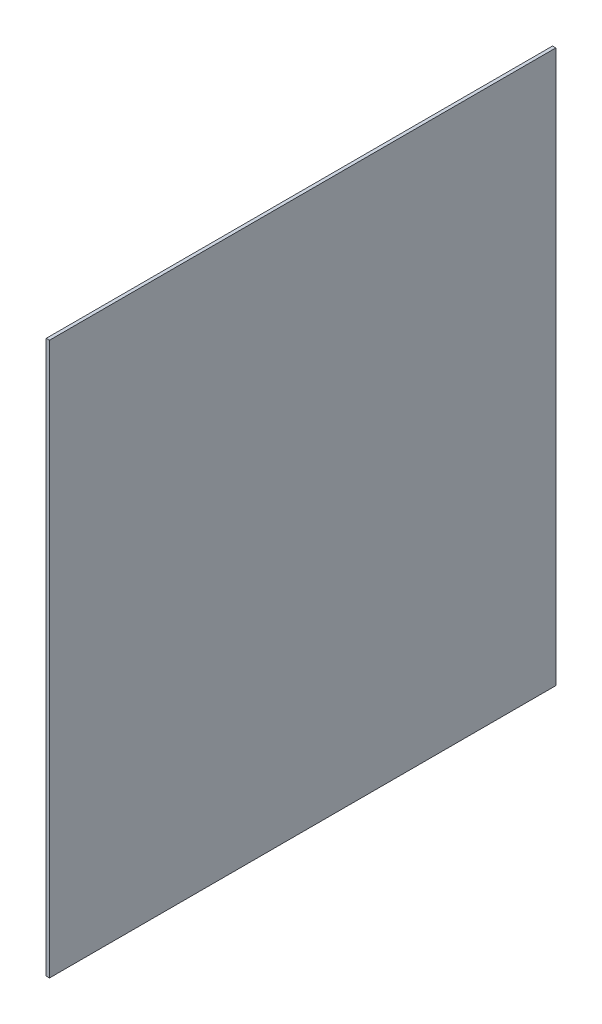
ISO-10303-21;
HEADER;
FILE_DESCRIPTION(('STEP AP214'),'2;1');
FILE_NAME('part.step','',(''),(''),'','','');
FILE_SCHEMA(('AUTOMOTIVE_DESIGN { 1 0 10303 214 1 1 1 1 }'));
ENDSEC;
DATA;
#1=APPLICATION_CONTEXT('core data for automotive mechanical design processes');
#2=APPLICATION_PROTOCOL_DEFINITION('international standard','automotive_design',2000,#1);
#3=PRODUCT_CONTEXT('',#1,'mechanical');
#4=PRODUCT('Part','Part','',(#3));
#5=PRODUCT_RELATED_PRODUCT_CATEGORY('part','',(#4));
#6=PRODUCT_DEFINITION_FORMATION('','',#4);
#7=PRODUCT_DEFINITION_CONTEXT('part definition',#1,'design');
#8=PRODUCT_DEFINITION('design','',#6,#7);
#9=PRODUCT_DEFINITION_SHAPE('','',#8);
#10=(LENGTH_UNIT() NAMED_UNIT(*) SI_UNIT(.MILLI.,.METRE.));
#11=(NAMED_UNIT(*) PLANE_ANGLE_UNIT() SI_UNIT($,.RADIAN.));
#12=(NAMED_UNIT(*) SI_UNIT($,.STERADIAN.) SOLID_ANGLE_UNIT());
#13=UNCERTAINTY_MEASURE_WITH_UNIT(LENGTH_MEASURE(1.E-05),#10,'distance_accuracy_value','');
#14=(GEOMETRIC_REPRESENTATION_CONTEXT(3) GLOBAL_UNCERTAINTY_ASSIGNED_CONTEXT((#13)) GLOBAL_UNIT_ASSIGNED_CONTEXT((#10,
#11,#12)) REPRESENTATION_CONTEXT('',''));
#15=CARTESIAN_POINT('',(0.,0.,0.));
#16=DIRECTION('',(0.,0.,1.));
#17=DIRECTION('',(1.,0.,0.));
#18=AXIS2_PLACEMENT_3D('',#15,#16,#17);
#19=CARTESIAN_POINT('',(12.7,0.,0.));
#20=DIRECTION('',(0.,0.,-1.));
#21=DIRECTION('',(-1.,0.,0.));
#22=AXIS2_PLACEMENT_3D('',#19,#20,#21);
#23=PLANE('',#22);
#24=DIRECTION('',(0.,-1.,0.));
#25=VECTOR('',#24,1.);
#26=CARTESIAN_POINT('',(0.,0.,0.));
#27=LINE('',#26,#25);
#28=CARTESIAN_POINT('',(0.,2133.6,0.));
#29=VERTEX_POINT('',#28);
#30=CARTESIAN_POINT('',(0.,0.,0.));
#31=VERTEX_POINT('',#30);
#32=EDGE_CURVE('E107',#29,#31,#27,.T.);
#33=ORIENTED_EDGE('',*,*,#32,.T.);
#34=DIRECTION('',(-1.,0.,0.));
#35=VECTOR('',#34,1.);
#36=CARTESIAN_POINT('',(12.7,0.,0.));
#37=LINE('',#36,#35);
#38=CARTESIAN_POINT('',(12.7,0.,0.));
#39=VERTEX_POINT('',#38);
#40=EDGE_CURVE('E11',#39,#31,#37,.T.);
#41=ORIENTED_EDGE('',*,*,#40,.F.);
#42=DIRECTION('',(0.,-1.,0.));
#43=VECTOR('',#42,1.);
#44=CARTESIAN_POINT('',(12.7,0.,0.));
#45=LINE('',#44,#43);
#46=CARTESIAN_POINT('',(12.7,2133.6,0.));
#47=VERTEX_POINT('',#46);
#48=EDGE_CURVE('E91',#47,#39,#45,.T.);
#49=ORIENTED_EDGE('',*,*,#48,.F.);
#50=DIRECTION('',(-1.,0.,0.));
#51=VECTOR('',#50,1.);
#52=CARTESIAN_POINT('',(12.7,2133.6,0.));
#53=LINE('',#52,#51);
#54=EDGE_CURVE('E103',#47,#29,#53,.T.);
#55=ORIENTED_EDGE('',*,*,#54,.T.);
#56=EDGE_LOOP('',(#33,#41,#49,#55));
#57=FACE_BOUND('',#56,.T.);
#58=ADVANCED_FACE('F39',(#57),#23,.F.);
#59=CARTESIAN_POINT('',(12.7,0.,0.));
#60=DIRECTION('',(0.,1.,0.));
#61=DIRECTION('',(0.,0.,1.));
#62=AXIS2_PLACEMENT_3D('',#59,#60,#61);
#63=PLANE('',#62);
#64=DIRECTION('',(0.,0.,-1.));
#65=VECTOR('',#64,1.);
#66=CARTESIAN_POINT('',(0.,0.,0.));
#67=LINE('',#66,#65);
#68=CARTESIAN_POINT('',(0.,0.,-1955.8));
#69=VERTEX_POINT('',#68);
#70=EDGE_CURVE('E96',#31,#69,#67,.T.);
#71=ORIENTED_EDGE('',*,*,#70,.T.);
#72=DIRECTION('',(-1.,0.,0.));
#73=VECTOR('',#72,1.);
#74=CARTESIAN_POINT('',(12.7,0.,-1955.8));
#75=LINE('',#74,#73);
#76=CARTESIAN_POINT('',(12.7,0.,-1955.8));
#77=VERTEX_POINT('',#76);
#78=EDGE_CURVE('E48',#77,#69,#75,.T.);
#79=ORIENTED_EDGE('',*,*,#78,.F.);
#80=DIRECTION('',(0.,0.,-1.));
#81=VECTOR('',#80,1.);
#82=CARTESIAN_POINT('',(12.7,0.,0.));
#83=LINE('',#82,#81);
#84=EDGE_CURVE('E86',#39,#77,#83,.T.);
#85=ORIENTED_EDGE('',*,*,#84,.F.);
#86=ORIENTED_EDGE('',*,*,#40,.T.);
#87=EDGE_LOOP('',(#71,#79,#85,#86));
#88=FACE_BOUND('',#87,.T.);
#89=ADVANCED_FACE('F95',(#88),#63,.F.);
#90=CARTESIAN_POINT('',(12.7,0.,-1955.8));
#91=DIRECTION('',(0.,0.,1.));
#92=DIRECTION('',(1.,0.,0.));
#93=AXIS2_PLACEMENT_3D('',#90,#91,#92);
#94=PLANE('',#93);
#95=DIRECTION('',(0.,1.,0.));
#96=VECTOR('',#95,1.);
#97=CARTESIAN_POINT('',(0.,0.,-1955.8));
#98=LINE('',#97,#96);
#99=CARTESIAN_POINT('',(0.,2133.6,-1955.8));
#100=VERTEX_POINT('',#99);
#101=EDGE_CURVE('E73',#69,#100,#98,.T.);
#102=ORIENTED_EDGE('',*,*,#101,.T.);
#103=DIRECTION('',(-1.,0.,0.));
#104=VECTOR('',#103,1.);
#105=CARTESIAN_POINT('',(12.7,2133.6,-1955.8));
#106=LINE('',#105,#104);
#107=CARTESIAN_POINT('',(12.7,2133.6,-1955.8));
#108=VERTEX_POINT('',#107);
#109=EDGE_CURVE('E98',#108,#100,#106,.T.);
#110=ORIENTED_EDGE('',*,*,#109,.F.);
#111=DIRECTION('',(0.,1.,0.));
#112=VECTOR('',#111,1.);
#113=CARTESIAN_POINT('',(12.7,0.,-1955.8));
#114=LINE('',#113,#112);
#115=EDGE_CURVE('E89',#77,#108,#114,.T.);
#116=ORIENTED_EDGE('',*,*,#115,.F.);
#117=ORIENTED_EDGE('',*,*,#78,.T.);
#118=EDGE_LOOP('',(#102,#110,#116,#117));
#119=FACE_BOUND('',#118,.T.);
#120=ADVANCED_FACE('F99',(#119),#94,.F.);
#121=CARTESIAN_POINT('',(12.7,2133.6,0.));
#122=DIRECTION('',(0.,-1.,0.));
#123=DIRECTION('',(0.,0.,-1.));
#124=AXIS2_PLACEMENT_3D('',#121,#122,#123);
#125=PLANE('',#124);
#126=DIRECTION('',(0.,0.,1.));
#127=VECTOR('',#126,1.);
#128=CARTESIAN_POINT('',(0.,2133.6,0.));
#129=LINE('',#128,#127);
#130=EDGE_CURVE('E79',#100,#29,#129,.T.);
#131=ORIENTED_EDGE('',*,*,#130,.T.);
#132=ORIENTED_EDGE('',*,*,#54,.F.);
#133=DIRECTION('',(0.,0.,1.));
#134=VECTOR('',#133,1.);
#135=CARTESIAN_POINT('',(12.7,2133.6,0.));
#136=LINE('',#135,#134);
#137=EDGE_CURVE('E56',#108,#47,#136,.T.);
#138=ORIENTED_EDGE('',*,*,#137,.F.);
#139=ORIENTED_EDGE('',*,*,#109,.T.);
#140=EDGE_LOOP('',(#131,#132,#138,#139));
#141=FACE_BOUND('',#140,.T.);
#142=ADVANCED_FACE('F120',(#141),#125,.F.);
#143=CARTESIAN_POINT('',(12.7,0.,0.));
#144=DIRECTION('',(-1.,0.,0.));
#145=DIRECTION('',(0.,0.,1.));
#146=AXIS2_PLACEMENT_3D('',#143,#144,#145);
#147=PLANE('',#146);
#148=ORIENTED_EDGE('',*,*,#48,.T.);
#149=ORIENTED_EDGE('',*,*,#84,.T.);
#150=ORIENTED_EDGE('',*,*,#115,.T.);
#151=ORIENTED_EDGE('',*,*,#137,.T.);
#152=EDGE_LOOP('',(#148,#149,#150,#151));
#153=FACE_BOUND('',#152,.T.);
#154=ADVANCED_FACE('F87',(#153),#147,.F.);
#155=CARTESIAN_POINT('',(0.,0.,0.));
#156=DIRECTION('',(-1.,0.,0.));
#157=DIRECTION('',(0.,0.,1.));
#158=AXIS2_PLACEMENT_3D('',#155,#156,#157);
#159=PLANE('',#158);
#160=ORIENTED_EDGE('',*,*,#32,.F.);
#161=ORIENTED_EDGE('',*,*,#130,.F.);
#162=ORIENTED_EDGE('',*,*,#101,.F.);
#163=ORIENTED_EDGE('',*,*,#70,.F.);
#164=EDGE_LOOP('',(#160,#161,#162,#163));
#165=FACE_BOUND('',#164,.T.);
#166=ADVANCED_FACE('F123',(#165),#159,.T.);
#167=CLOSED_SHELL('',(#58,#89,#120,#142,#154,#166));
#168=MANIFOLD_SOLID_BREP('B2',#167);
#169=ADVANCED_BREP_SHAPE_REPRESENTATION('',(#18,#168),#14);
#170=SHAPE_DEFINITION_REPRESENTATION(#9,#169);
ENDSEC;
END-ISO-10303-21;
